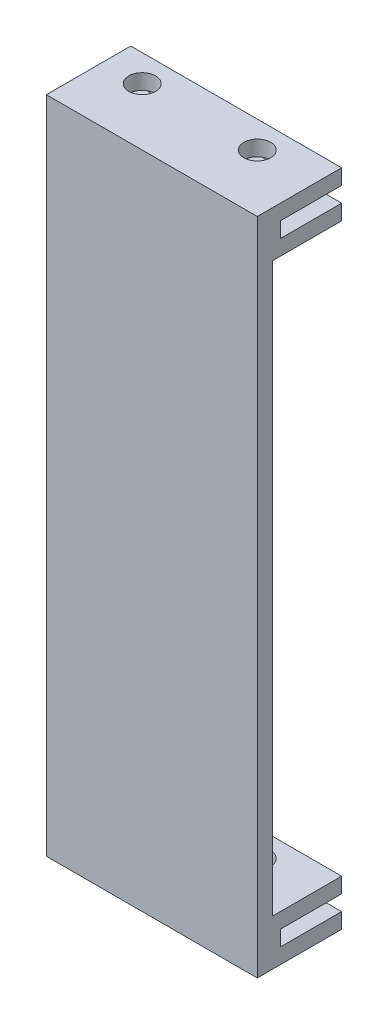
ISO-10303-21;
HEADER;
FILE_DESCRIPTION(('STEP AP214'),'2;1');
FILE_NAME('part.step','',(''),(''),'','','');
FILE_SCHEMA(('AUTOMOTIVE_DESIGN { 1 0 10303 214 1 1 1 1 }'));
ENDSEC;
DATA;
#1=APPLICATION_CONTEXT('core data for automotive mechanical design processes');
#2=APPLICATION_PROTOCOL_DEFINITION('international standard','automotive_design',2000,#1);
#3=PRODUCT_CONTEXT('',#1,'mechanical');
#4=PRODUCT('Part','Part','',(#3));
#5=PRODUCT_RELATED_PRODUCT_CATEGORY('part','',(#4));
#6=PRODUCT_DEFINITION_FORMATION('','',#4);
#7=PRODUCT_DEFINITION_CONTEXT('part definition',#1,'design');
#8=PRODUCT_DEFINITION('design','',#6,#7);
#9=PRODUCT_DEFINITION_SHAPE('','',#8);
#10=(LENGTH_UNIT() NAMED_UNIT(*) SI_UNIT(.MILLI.,.METRE.));
#11=(NAMED_UNIT(*) PLANE_ANGLE_UNIT() SI_UNIT($,.RADIAN.));
#12=(NAMED_UNIT(*) SI_UNIT($,.STERADIAN.) SOLID_ANGLE_UNIT());
#13=UNCERTAINTY_MEASURE_WITH_UNIT(LENGTH_MEASURE(1.E-05),#10,'distance_accuracy_value','');
#14=(GEOMETRIC_REPRESENTATION_CONTEXT(3) GLOBAL_UNCERTAINTY_ASSIGNED_CONTEXT((#13)) GLOBAL_UNIT_ASSIGNED_CONTEXT((#10,
#11,#12)) REPRESENTATION_CONTEXT('',''));
#15=CARTESIAN_POINT('',(0.,0.,0.));
#16=DIRECTION('',(0.,0.,1.));
#17=DIRECTION('',(1.,0.,0.));
#18=AXIS2_PLACEMENT_3D('',#15,#16,#17);
#19=CARTESIAN_POINT('',(-15.,80.,-5.5));
#20=DIRECTION('',(0.,0.,-1.));
#21=DIRECTION('',(-1.,0.,0.));
#22=AXIS2_PLACEMENT_3D('',#19,#20,#21);
#23=PLANE('',#22);
#24=DIRECTION('',(-1.,0.,0.));
#25=VECTOR('',#24,1.);
#26=CARTESIAN_POINT('',(-15.,80.,-5.5));
#27=LINE('',#26,#25);
#28=CARTESIAN_POINT('',(15.,80.,-5.5));
#29=VERTEX_POINT('',#28);
#30=CARTESIAN_POINT('',(-12.5,80.,-5.5));
#31=VERTEX_POINT('',#30);
#32=EDGE_CURVE('E322',#29,#31,#27,.T.);
#33=ORIENTED_EDGE('',*,*,#32,.T.);
#34=DIRECTION('',(0.,1.,0.));
#35=VECTOR('',#34,1.);
#36=CARTESIAN_POINT('',(-12.5,86.,-5.5));
#37=LINE('',#36,#35);
#38=CARTESIAN_POINT('',(-12.5,82.,-5.5));
#39=VERTEX_POINT('',#38);
#40=EDGE_CURVE('E178',#31,#39,#37,.T.);
#41=ORIENTED_EDGE('',*,*,#40,.T.);
#42=DIRECTION('',(1.,0.,0.));
#43=VECTOR('',#42,1.);
#44=CARTESIAN_POINT('',(-15.,82.,-5.5));
#45=LINE('',#44,#43);
#46=CARTESIAN_POINT('',(15.,82.,-5.5));
#47=VERTEX_POINT('',#46);
#48=EDGE_CURVE('E54',#39,#47,#45,.T.);
#49=ORIENTED_EDGE('',*,*,#48,.T.);
#50=DIRECTION('',(0.,1.,0.));
#51=VECTOR('',#50,1.);
#52=CARTESIAN_POINT('',(15.,80.,-5.5));
#53=LINE('',#52,#51);
#54=EDGE_CURVE('E195',#29,#47,#53,.T.);
#55=ORIENTED_EDGE('',*,*,#54,.F.);
#56=EDGE_LOOP('',(#33,#41,#49,#55));
#57=FACE_BOUND('',#56,.T.);
#58=ADVANCED_FACE('F50',(#57),#23,.T.);
#59=DIRECTION('',(-1.,0.,0.));
#60=VECTOR('',#59,1.);
#61=CARTESIAN_POINT('',(-15.,84.,-5.5));
#62=LINE('',#61,#60);
#63=CARTESIAN_POINT('',(15.,84.,-5.5));
#64=VERTEX_POINT('',#63);
#65=CARTESIAN_POINT('',(-12.5,84.,-5.5));
#66=VERTEX_POINT('',#65);
#67=EDGE_CURVE('E279',#64,#66,#62,.T.);
#68=ORIENTED_EDGE('',*,*,#67,.T.);
#69=CARTESIAN_POINT('',(-12.5,86.,-5.5));
#70=VERTEX_POINT('',#69);
#71=EDGE_CURVE('E62',#66,#70,#37,.T.);
#72=ORIENTED_EDGE('',*,*,#71,.T.);
#73=DIRECTION('',(-1.,0.,0.));
#74=VECTOR('',#73,1.);
#75=CARTESIAN_POINT('',(-15.,86.,-5.5));
#76=LINE('',#75,#74);
#77=CARTESIAN_POINT('',(15.,86.,-5.5));
#78=VERTEX_POINT('',#77);
#79=EDGE_CURVE('E176',#78,#70,#76,.T.);
#80=ORIENTED_EDGE('',*,*,#79,.F.);
#81=EDGE_CURVE('E198',#64,#78,#53,.T.);
#82=ORIENTED_EDGE('',*,*,#81,.F.);
#83=EDGE_LOOP('',(#68,#72,#80,#82));
#84=FACE_BOUND('',#83,.T.);
#85=ADVANCED_FACE('F335',(#84),#23,.T.);
#86=CARTESIAN_POINT('',(15.,6.,-5.5));
#87=DIRECTION('',(-1.,0.,0.));
#88=DIRECTION('',(0.,0.,1.));
#89=AXIS2_PLACEMENT_3D('',#86,#87,#88);
#90=PLANE('',#89);
#91=DIRECTION('',(0.,0.,-1.));
#92=VECTOR('',#91,1.);
#93=CARTESIAN_POINT('',(15.,82.,-5.5));
#94=LINE('',#93,#92);
#95=CARTESIAN_POINT('',(15.,82.,2.5));
#96=VERTEX_POINT('',#95);
#97=EDGE_CURVE('E320',#96,#47,#94,.T.);
#98=ORIENTED_EDGE('',*,*,#97,.F.);
#99=DIRECTION('',(0.,-1.,0.));
#100=VECTOR('',#99,1.);
#101=CARTESIAN_POINT('',(15.,6.,2.5));
#102=LINE('',#101,#100);
#103=CARTESIAN_POINT('',(15.,84.,2.5));
#104=VERTEX_POINT('',#103);
#105=EDGE_CURVE('E189',#104,#96,#102,.T.);
#106=ORIENTED_EDGE('',*,*,#105,.F.);
#107=DIRECTION('',(0.,0.,1.));
#108=VECTOR('',#107,1.);
#109=CARTESIAN_POINT('',(15.,84.,-5.5));
#110=LINE('',#109,#108);
#111=EDGE_CURVE('E312',#64,#104,#110,.T.);
#112=ORIENTED_EDGE('',*,*,#111,.F.);
#113=ORIENTED_EDGE('',*,*,#81,.T.);
#114=DIRECTION('',(0.,0.,-1.));
#115=VECTOR('',#114,1.);
#116=CARTESIAN_POINT('',(15.,86.,-5.5));
#117=LINE('',#116,#115);
#118=CARTESIAN_POINT('',(15.,86.,5.5));
#119=VERTEX_POINT('',#118);
#120=EDGE_CURVE('E183',#119,#78,#117,.T.);
#121=ORIENTED_EDGE('',*,*,#120,.F.);
#122=DIRECTION('',(0.,-1.,0.));
#123=VECTOR('',#122,1.);
#124=CARTESIAN_POINT('',(15.,6.,5.5));
#125=LINE('',#124,#123);
#126=CARTESIAN_POINT('',(15.,0.,5.5));
#127=VERTEX_POINT('',#126);
#128=EDGE_CURVE('E185',#119,#127,#125,.T.);
#129=ORIENTED_EDGE('',*,*,#128,.T.);
#130=DIRECTION('',(0.,0.,-1.));
#131=VECTOR('',#130,1.);
#132=CARTESIAN_POINT('',(15.,0.,-5.5));
#133=LINE('',#132,#131);
#134=CARTESIAN_POINT('',(15.,0.,-5.5));
#135=VERTEX_POINT('',#134);
#136=EDGE_CURVE('E257',#127,#135,#133,.T.);
#137=ORIENTED_EDGE('',*,*,#136,.T.);
#138=DIRECTION('',(0.,-1.,0.));
#139=VECTOR('',#138,1.);
#140=CARTESIAN_POINT('',(15.,6.,-5.5));
#141=LINE('',#140,#139);
#142=CARTESIAN_POINT('',(15.,2.,-5.5));
#143=VERTEX_POINT('',#142);
#144=EDGE_CURVE('E266',#143,#135,#141,.T.);
#145=ORIENTED_EDGE('',*,*,#144,.F.);
#146=DIRECTION('',(0.,0.,1.));
#147=VECTOR('',#146,1.);
#148=CARTESIAN_POINT('',(15.,2.,-5.5));
#149=LINE('',#148,#147);
#150=CARTESIAN_POINT('',(15.,2.,2.5));
#151=VERTEX_POINT('',#150);
#152=EDGE_CURVE('E254',#143,#151,#149,.T.);
#153=ORIENTED_EDGE('',*,*,#152,.T.);
#154=DIRECTION('',(0.,1.,0.));
#155=VECTOR('',#154,1.);
#156=CARTESIAN_POINT('',(15.,6.,2.5));
#157=LINE('',#156,#155);
#158=CARTESIAN_POINT('',(15.,4.,2.5));
#159=VERTEX_POINT('',#158);
#160=EDGE_CURVE('E244',#151,#159,#157,.T.);
#161=ORIENTED_EDGE('',*,*,#160,.T.);
#162=DIRECTION('',(0.,0.,-1.));
#163=VECTOR('',#162,1.);
#164=CARTESIAN_POINT('',(15.,4.,-5.5));
#165=LINE('',#164,#163);
#166=CARTESIAN_POINT('',(15.,4.,-5.5));
#167=VERTEX_POINT('',#166);
#168=EDGE_CURVE('E249',#159,#167,#165,.T.);
#169=ORIENTED_EDGE('',*,*,#168,.T.);
#170=CARTESIAN_POINT('',(15.,6.,-5.5));
#171=VERTEX_POINT('',#170);
#172=EDGE_CURVE('E268',#171,#167,#141,.T.);
#173=ORIENTED_EDGE('',*,*,#172,.F.);
#174=DIRECTION('',(0.,0.,-1.));
#175=VECTOR('',#174,1.);
#176=CARTESIAN_POINT('',(15.,6.,-5.5));
#177=LINE('',#176,#175);
#178=CARTESIAN_POINT('',(15.,6.,3.5));
#179=VERTEX_POINT('',#178);
#180=EDGE_CURVE('E260',#179,#171,#177,.T.);
#181=ORIENTED_EDGE('',*,*,#180,.F.);
#182=DIRECTION('',(0.,-1.,0.));
#183=VECTOR('',#182,1.);
#184=CARTESIAN_POINT('',(15.,80.,3.5));
#185=LINE('',#184,#183);
#186=CARTESIAN_POINT('',(15.,80.,3.5));
#187=VERTEX_POINT('',#186);
#188=EDGE_CURVE('E240',#187,#179,#185,.T.);
#189=ORIENTED_EDGE('',*,*,#188,.F.);
#190=DIRECTION('',(0.,0.,-1.));
#191=VECTOR('',#190,1.);
#192=CARTESIAN_POINT('',(15.,80.,-5.5));
#193=LINE('',#192,#191);
#194=EDGE_CURVE('E187',#187,#29,#193,.T.);
#195=ORIENTED_EDGE('',*,*,#194,.T.);
#196=ORIENTED_EDGE('',*,*,#54,.T.);
#197=EDGE_LOOP('',(#98,#106,#112,#113,#121,#129,#137,#145,#153,#161,#169,#173,#181,#189,#195,#196));
#198=FACE_BOUND('',#197,.T.);
#199=ADVANCED_FACE('F47',(#198),#90,.F.);
#200=CARTESIAN_POINT('',(-15.,6.,-5.5));
#201=DIRECTION('',(0.,0.,1.));
#202=DIRECTION('',(1.,0.,0.));
#203=AXIS2_PLACEMENT_3D('',#200,#201,#202);
#204=PLANE('',#203);
#205=DIRECTION('',(0.,-1.,0.));
#206=VECTOR('',#205,1.);
#207=CARTESIAN_POINT('',(-12.5,0.,-5.5));
#208=LINE('',#207,#206);
#209=CARTESIAN_POINT('',(-12.5,2.,-5.5));
#210=VERTEX_POINT('',#209);
#211=CARTESIAN_POINT('',(-12.5,0.,-5.5));
#212=VERTEX_POINT('',#211);
#213=EDGE_CURVE('E193',#210,#212,#208,.T.);
#214=ORIENTED_EDGE('',*,*,#213,.F.);
#215=DIRECTION('',(1.,0.,0.));
#216=VECTOR('',#215,1.);
#217=CARTESIAN_POINT('',(-15.,2.,-5.5));
#218=LINE('',#217,#216);
#219=EDGE_CURVE('E277',#210,#143,#218,.T.);
#220=ORIENTED_EDGE('',*,*,#219,.T.);
#221=ORIENTED_EDGE('',*,*,#144,.T.);
#222=DIRECTION('',(-1.,0.,0.));
#223=VECTOR('',#222,1.);
#224=CARTESIAN_POINT('',(-15.,0.,-5.5));
#225=LINE('',#224,#223);
#226=EDGE_CURVE('E264',#135,#212,#225,.T.);
#227=ORIENTED_EDGE('',*,*,#226,.T.);
#228=EDGE_LOOP('',(#214,#220,#221,#227));
#229=FACE_BOUND('',#228,.T.);
#230=ADVANCED_FACE('F415',(#229),#204,.F.);
#231=CARTESIAN_POINT('',(-15.,6.,5.5));
#232=DIRECTION('',(0.,0.,-1.));
#233=DIRECTION('',(-1.,0.,0.));
#234=AXIS2_PLACEMENT_3D('',#231,#232,#233);
#235=PLANE('',#234);
#236=DIRECTION('',(1.,0.,0.));
#237=VECTOR('',#236,1.);
#238=CARTESIAN_POINT('',(-15.,86.,5.5));
#239=LINE('',#238,#237);
#240=CARTESIAN_POINT('',(-12.5,86.,5.5));
#241=VERTEX_POINT('',#240);
#242=EDGE_CURVE('E173',#241,#119,#239,.T.);
#243=ORIENTED_EDGE('',*,*,#242,.F.);
#244=DIRECTION('',(0.,1.,0.));
#245=VECTOR('',#244,1.);
#246=CARTESIAN_POINT('',(-12.5,0.,5.5));
#247=LINE('',#246,#245);
#248=CARTESIAN_POINT('',(-12.5,0.,5.5));
#249=VERTEX_POINT('',#248);
#250=EDGE_CURVE('E160',#249,#241,#247,.T.);
#251=ORIENTED_EDGE('',*,*,#250,.F.);
#252=DIRECTION('',(1.,0.,0.));
#253=VECTOR('',#252,1.);
#254=CARTESIAN_POINT('',(-15.,0.,5.5));
#255=LINE('',#254,#253);
#256=EDGE_CURVE('E258',#249,#127,#255,.T.);
#257=ORIENTED_EDGE('',*,*,#256,.T.);
#258=ORIENTED_EDGE('',*,*,#128,.F.);
#259=EDGE_LOOP('',(#243,#251,#257,#258));
#260=FACE_BOUND('',#259,.T.);
#261=ADVANCED_FACE('F179',(#260),#235,.F.);
#262=CARTESIAN_POINT('',(0.,0.,0.));
#263=DIRECTION('',(0.,1.,0.));
#264=DIRECTION('',(0.,0.,1.));
#265=AXIS2_PLACEMENT_3D('',#262,#263,#264);
#266=PLANE('',#265);
#267=CARTESIAN_POINT('',(7.5,0.,-2.));
#268=DIRECTION('',(0.,1.,0.));
#269=DIRECTION('',(0.,0.,1.));
#270=AXIS2_PLACEMENT_3D('',#267,#268,#269);
#271=CIRCLE('',#270,1.75);
#272=CARTESIAN_POINT('',(7.5,0.,-0.249999999999999));
#273=VERTEX_POINT('',#272);
#274=EDGE_CURVE('E221',#273,#273,#271,.T.);
#275=ORIENTED_EDGE('',*,*,#274,.T.);
#276=EDGE_LOOP('',(#275));
#277=FACE_BOUND('',#276,.T.);
#278=CARTESIAN_POINT('',(-7.5,0.,-2.));
#279=DIRECTION('',(0.,1.,0.));
#280=DIRECTION('',(0.,0.,1.));
#281=AXIS2_PLACEMENT_3D('',#278,#279,#280);
#282=CIRCLE('',#281,1.75);
#283=CARTESIAN_POINT('',(-7.5,0.,-0.25));
#284=VERTEX_POINT('',#283);
#285=EDGE_CURVE('E233',#284,#284,#282,.T.);
#286=ORIENTED_EDGE('',*,*,#285,.T.);
#287=EDGE_LOOP('',(#286));
#288=FACE_BOUND('',#287,.T.);
#289=DIRECTION('',(0.,0.,1.));
#290=VECTOR('',#289,1.);
#291=CARTESIAN_POINT('',(-12.5,0.,-5.5));
#292=LINE('',#291,#290);
#293=EDGE_CURVE('E161',#212,#249,#292,.T.);
#294=ORIENTED_EDGE('',*,*,#293,.F.);
#295=ORIENTED_EDGE('',*,*,#226,.F.);
#296=ORIENTED_EDGE('',*,*,#136,.F.);
#297=ORIENTED_EDGE('',*,*,#256,.F.);
#298=EDGE_LOOP('',(#294,#295,#296,#297));
#299=FACE_BOUND('',#298,.T.);
#300=ADVANCED_FACE('F410',(#277,#288,#299),#266,.F.);
#301=CARTESIAN_POINT('',(-12.5,6.,-5.5));
#302=VERTEX_POINT('',#301);
#303=CARTESIAN_POINT('',(-12.5,4.,-5.5));
#304=VERTEX_POINT('',#303);
#305=EDGE_CURVE('E196',#302,#304,#208,.T.);
#306=ORIENTED_EDGE('',*,*,#305,.F.);
#307=DIRECTION('',(-1.,0.,0.));
#308=VECTOR('',#307,1.);
#309=CARTESIAN_POINT('',(-15.,6.,-5.5));
#310=LINE('',#309,#308);
#311=EDGE_CURVE('E256',#171,#302,#310,.T.);
#312=ORIENTED_EDGE('',*,*,#311,.F.);
#313=ORIENTED_EDGE('',*,*,#172,.T.);
#314=DIRECTION('',(-1.,0.,0.));
#315=VECTOR('',#314,1.);
#316=CARTESIAN_POINT('',(-15.,4.,-5.5));
#317=LINE('',#316,#315);
#318=EDGE_CURVE('E271',#167,#304,#317,.T.);
#319=ORIENTED_EDGE('',*,*,#318,.T.);
#320=EDGE_LOOP('',(#306,#312,#313,#319));
#321=FACE_BOUND('',#320,.T.);
#322=ADVANCED_FACE('F407',(#321),#204,.F.);
#323=CARTESIAN_POINT('',(0.,6.,0.));
#324=DIRECTION('',(0.,1.,0.));
#325=DIRECTION('',(0.,0.,1.));
#326=AXIS2_PLACEMENT_3D('',#323,#324,#325);
#327=PLANE('',#326);
#328=DIRECTION('',(0.,0.,-1.));
#329=VECTOR('',#328,1.);
#330=CARTESIAN_POINT('',(-12.5,6.,0.));
#331=LINE('',#330,#329);
#332=CARTESIAN_POINT('',(-12.5,6.00000000000001,3.5));
#333=VERTEX_POINT('',#332);
#334=EDGE_CURVE('E204',#333,#302,#331,.T.);
#335=ORIENTED_EDGE('',*,*,#334,.F.);
#336=DIRECTION('',(-1.,0.,0.));
#337=VECTOR('',#336,1.);
#338=CARTESIAN_POINT('',(-2.,6.,3.5));
#339=LINE('',#338,#337);
#340=EDGE_CURVE('E69',#179,#333,#339,.T.);
#341=ORIENTED_EDGE('',*,*,#340,.F.);
#342=ORIENTED_EDGE('',*,*,#180,.T.);
#343=ORIENTED_EDGE('',*,*,#311,.T.);
#344=EDGE_LOOP('',(#335,#341,#342,#343));
#345=FACE_BOUND('',#344,.T.);
#346=CARTESIAN_POINT('',(-7.5,6.,-2.));
#347=DIRECTION('',(0.,1.,0.));
#348=DIRECTION('',(0.,0.,1.));
#349=AXIS2_PLACEMENT_3D('',#346,#347,#348);
#350=CIRCLE('',#349,1.75);
#351=CARTESIAN_POINT('',(-7.5,6.,-0.25));
#352=VERTEX_POINT('',#351);
#353=EDGE_CURVE('E213',#352,#352,#350,.T.);
#354=ORIENTED_EDGE('',*,*,#353,.F.);
#355=EDGE_LOOP('',(#354));
#356=FACE_BOUND('',#355,.T.);
#357=CARTESIAN_POINT('',(7.5,6.,-2.));
#358=DIRECTION('',(0.,1.,0.));
#359=DIRECTION('',(0.,0.,-1.));
#360=AXIS2_PLACEMENT_3D('',#357,#358,#359);
#361=CIRCLE('',#360,1.75);
#362=CARTESIAN_POINT('',(7.5,6.,-3.75));
#363=VERTEX_POINT('',#362);
#364=EDGE_CURVE('E211',#363,#363,#361,.T.);
#365=ORIENTED_EDGE('',*,*,#364,.F.);
#366=EDGE_LOOP('',(#365));
#367=FACE_BOUND('',#366,.T.);
#368=ADVANCED_FACE('F399',(#345,#356,#367),#327,.T.);
#369=CARTESIAN_POINT('',(129.,2.,-13.5));
#370=DIRECTION('',(0.,-1.,0.));
#371=DIRECTION('',(0.,0.,-1.));
#372=AXIS2_PLACEMENT_3D('',#369,#370,#371);
#373=PLANE('',#372);
#374=CARTESIAN_POINT('',(-7.5,2.,-2.));
#375=DIRECTION('',(0.,-1.,0.));
#376=DIRECTION('',(0.,0.,-1.));
#377=AXIS2_PLACEMENT_3D('',#374,#375,#376);
#378=CIRCLE('',#377,1.75);
#379=CARTESIAN_POINT('',(-7.5,2.,-3.75));
#380=VERTEX_POINT('',#379);
#381=EDGE_CURVE('E226',#380,#380,#378,.T.);
#382=ORIENTED_EDGE('',*,*,#381,.T.);
#383=EDGE_LOOP('',(#382));
#384=FACE_BOUND('',#383,.T.);
#385=CARTESIAN_POINT('',(7.5,2.,-2.));
#386=DIRECTION('',(0.,-1.,0.));
#387=DIRECTION('',(0.,0.,-1.));
#388=AXIS2_PLACEMENT_3D('',#385,#386,#387);
#389=CIRCLE('',#388,1.75);
#390=CARTESIAN_POINT('',(7.5,2.,-3.75));
#391=VERTEX_POINT('',#390);
#392=EDGE_CURVE('E222',#391,#391,#389,.T.);
#393=ORIENTED_EDGE('',*,*,#392,.T.);
#394=EDGE_LOOP('',(#393));
#395=FACE_BOUND('',#394,.T.);
#396=ORIENTED_EDGE('',*,*,#219,.F.);
#397=DIRECTION('',(0.,0.,1.));
#398=VECTOR('',#397,1.);
#399=CARTESIAN_POINT('',(-12.5,2.,-13.5));
#400=LINE('',#399,#398);
#401=CARTESIAN_POINT('',(-12.5,2.,2.5));
#402=VERTEX_POINT('',#401);
#403=EDGE_CURVE('E212',#210,#402,#400,.T.);
#404=ORIENTED_EDGE('',*,*,#403,.T.);
#405=DIRECTION('',(-1.,0.,0.));
#406=VECTOR('',#405,1.);
#407=CARTESIAN_POINT('',(129.,2.,2.5));
#408=LINE('',#407,#406);
#409=EDGE_CURVE('E245',#151,#402,#408,.T.);
#410=ORIENTED_EDGE('',*,*,#409,.F.);
#411=ORIENTED_EDGE('',*,*,#152,.F.);
#412=EDGE_LOOP('',(#396,#404,#410,#411));
#413=FACE_BOUND('',#412,.T.);
#414=ADVANCED_FACE('F391',(#384,#395,#413),#373,.F.);
#415=CARTESIAN_POINT('',(129.,4.,-13.5));
#416=DIRECTION('',(0.,1.,0.));
#417=DIRECTION('',(0.,0.,1.));
#418=AXIS2_PLACEMENT_3D('',#415,#416,#417);
#419=PLANE('',#418);
#420=CARTESIAN_POINT('',(-7.5,4.,-2.));
#421=DIRECTION('',(0.,1.,0.));
#422=DIRECTION('',(0.,0.,1.));
#423=AXIS2_PLACEMENT_3D('',#420,#421,#422);
#424=CIRCLE('',#423,1.75);
#425=CARTESIAN_POINT('',(-7.5,4.,-0.25));
#426=VERTEX_POINT('',#425);
#427=EDGE_CURVE('E227',#426,#426,#424,.T.);
#428=ORIENTED_EDGE('',*,*,#427,.T.);
#429=EDGE_LOOP('',(#428));
#430=FACE_BOUND('',#429,.T.);
#431=CARTESIAN_POINT('',(7.5,4.,-2.));
#432=DIRECTION('',(0.,1.,0.));
#433=DIRECTION('',(0.,0.,1.));
#434=AXIS2_PLACEMENT_3D('',#431,#432,#433);
#435=CIRCLE('',#434,1.75);
#436=CARTESIAN_POINT('',(7.5,4.,-0.249999999999999));
#437=VERTEX_POINT('',#436);
#438=EDGE_CURVE('E216',#437,#437,#435,.T.);
#439=ORIENTED_EDGE('',*,*,#438,.T.);
#440=EDGE_LOOP('',(#439));
#441=FACE_BOUND('',#440,.T.);
#442=DIRECTION('',(-1.,0.,0.));
#443=VECTOR('',#442,1.);
#444=CARTESIAN_POINT('',(129.,4.,2.5));
#445=LINE('',#444,#443);
#446=CARTESIAN_POINT('',(-12.5,4.,2.5));
#447=VERTEX_POINT('',#446);
#448=EDGE_CURVE('E241',#159,#447,#445,.T.);
#449=ORIENTED_EDGE('',*,*,#448,.T.);
#450=DIRECTION('',(0.,0.,-1.));
#451=VECTOR('',#450,1.);
#452=CARTESIAN_POINT('',(-12.5,4.,-13.5));
#453=LINE('',#452,#451);
#454=EDGE_CURVE('E206',#447,#304,#453,.T.);
#455=ORIENTED_EDGE('',*,*,#454,.T.);
#456=ORIENTED_EDGE('',*,*,#318,.F.);
#457=ORIENTED_EDGE('',*,*,#168,.F.);
#458=EDGE_LOOP('',(#449,#455,#456,#457));
#459=FACE_BOUND('',#458,.T.);
#460=ADVANCED_FACE('F397',(#430,#441,#459),#419,.F.);
#461=CARTESIAN_POINT('',(129.,2.,2.5));
#462=DIRECTION('',(0.,0.,1.));
#463=DIRECTION('',(1.,0.,0.));
#464=AXIS2_PLACEMENT_3D('',#461,#462,#463);
#465=PLANE('',#464);
#466=ORIENTED_EDGE('',*,*,#409,.T.);
#467=DIRECTION('',(0.,1.,0.));
#468=VECTOR('',#467,1.);
#469=CARTESIAN_POINT('',(-12.5,2.,2.5));
#470=LINE('',#469,#468);
#471=EDGE_CURVE('E203',#402,#447,#470,.T.);
#472=ORIENTED_EDGE('',*,*,#471,.T.);
#473=ORIENTED_EDGE('',*,*,#448,.F.);
#474=ORIENTED_EDGE('',*,*,#160,.F.);
#475=EDGE_LOOP('',(#466,#472,#473,#474));
#476=FACE_BOUND('',#475,.T.);
#477=ADVANCED_FACE('F393',(#476),#465,.F.);
#478=CARTESIAN_POINT('',(-2.,80.,3.5));
#479=DIRECTION('',(0.,0.,1.));
#480=DIRECTION('',(1.,0.,0.));
#481=AXIS2_PLACEMENT_3D('',#478,#479,#480);
#482=PLANE('',#481);
#483=ORIENTED_EDGE('',*,*,#340,.T.);
#484=DIRECTION('',(0.,1.,0.));
#485=VECTOR('',#484,1.);
#486=CARTESIAN_POINT('',(-12.5,80.,3.5));
#487=LINE('',#486,#485);
#488=CARTESIAN_POINT('',(-12.5,80.,3.5));
#489=VERTEX_POINT('',#488);
#490=EDGE_CURVE('E170',#333,#489,#487,.T.);
#491=ORIENTED_EDGE('',*,*,#490,.T.);
#492=DIRECTION('',(-1.,0.,0.));
#493=VECTOR('',#492,1.);
#494=CARTESIAN_POINT('',(-2.,80.,3.5));
#495=LINE('',#494,#493);
#496=EDGE_CURVE('E234',#187,#489,#495,.T.);
#497=ORIENTED_EDGE('',*,*,#496,.F.);
#498=ORIENTED_EDGE('',*,*,#188,.T.);
#499=EDGE_LOOP('',(#483,#491,#497,#498));
#500=FACE_BOUND('',#499,.T.);
#501=ADVANCED_FACE('F389',(#500),#482,.F.);
#502=CARTESIAN_POINT('',(7.5,-138.,-2.));
#503=DIRECTION('',(0.,1.,0.));
#504=DIRECTION('',(0.,0.,1.));
#505=AXIS2_PLACEMENT_3D('',#502,#503,#504);
#506=CYLINDRICAL_SURFACE('',#505,1.75);
#507=ORIENTED_EDGE('',*,*,#364,.T.);
#508=EDGE_LOOP('',(#507));
#509=FACE_BOUND('',#508,.T.);
#510=ORIENTED_EDGE('',*,*,#438,.F.);
#511=EDGE_LOOP('',(#510));
#512=FACE_BOUND('',#511,.T.);
#513=ADVANCED_FACE('F390',(#509,#512),#506,.F.);
#514=CARTESIAN_POINT('',(-7.5,-138.,-2.));
#515=DIRECTION('',(0.,1.,0.));
#516=DIRECTION('',(0.,0.,1.));
#517=AXIS2_PLACEMENT_3D('',#514,#515,#516);
#518=CYLINDRICAL_SURFACE('',#517,1.75);
#519=ORIENTED_EDGE('',*,*,#353,.T.);
#520=EDGE_LOOP('',(#519));
#521=FACE_BOUND('',#520,.T.);
#522=ORIENTED_EDGE('',*,*,#427,.F.);
#523=EDGE_LOOP('',(#522));
#524=FACE_BOUND('',#523,.T.);
#525=ADVANCED_FACE('F384',(#521,#524),#518,.F.);
#526=ORIENTED_EDGE('',*,*,#392,.F.);
#527=EDGE_LOOP('',(#526));
#528=FACE_BOUND('',#527,.T.);
#529=ORIENTED_EDGE('',*,*,#274,.F.);
#530=EDGE_LOOP('',(#529));
#531=FACE_BOUND('',#530,.T.);
#532=ADVANCED_FACE('F382',(#528,#531),#506,.F.);
#533=ORIENTED_EDGE('',*,*,#381,.F.);
#534=EDGE_LOOP('',(#533));
#535=FACE_BOUND('',#534,.T.);
#536=ORIENTED_EDGE('',*,*,#285,.F.);
#537=EDGE_LOOP('',(#536));
#538=FACE_BOUND('',#537,.T.);
#539=ADVANCED_FACE('F377',(#535,#538),#518,.F.);
#540=CARTESIAN_POINT('',(-12.5,0.,0.));
#541=DIRECTION('',(1.,0.,0.));
#542=DIRECTION('',(0.,0.,-1.));
#543=AXIS2_PLACEMENT_3D('',#540,#541,#542);
#544=PLANE('',#543);
#545=ORIENTED_EDGE('',*,*,#250,.T.);
#546=DIRECTION('',(0.,0.,1.));
#547=VECTOR('',#546,1.);
#548=CARTESIAN_POINT('',(-12.5,86.,-5.5));
#549=LINE('',#548,#547);
#550=EDGE_CURVE('E163',#70,#241,#549,.T.);
#551=ORIENTED_EDGE('',*,*,#550,.F.);
#552=ORIENTED_EDGE('',*,*,#71,.F.);
#553=DIRECTION('',(0.,0.,1.));
#554=VECTOR('',#553,1.);
#555=CARTESIAN_POINT('',(-12.5,84.,-13.5));
#556=LINE('',#555,#554);
#557=CARTESIAN_POINT('',(-12.5,84.,2.5));
#558=VERTEX_POINT('',#557);
#559=EDGE_CURVE('E11',#66,#558,#556,.T.);
#560=ORIENTED_EDGE('',*,*,#559,.T.);
#561=DIRECTION('',(0.,-1.,0.));
#562=VECTOR('',#561,1.);
#563=CARTESIAN_POINT('',(-12.5,84.,2.5));
#564=LINE('',#563,#562);
#565=CARTESIAN_POINT('',(-12.5,82.,2.5));
#566=VERTEX_POINT('',#565);
#567=EDGE_CURVE('E180',#558,#566,#564,.T.);
#568=ORIENTED_EDGE('',*,*,#567,.T.);
#569=DIRECTION('',(0.,0.,-1.));
#570=VECTOR('',#569,1.);
#571=CARTESIAN_POINT('',(-12.5,82.,-13.5));
#572=LINE('',#571,#570);
#573=EDGE_CURVE('E340',#566,#39,#572,.T.);
#574=ORIENTED_EDGE('',*,*,#573,.T.);
#575=ORIENTED_EDGE('',*,*,#40,.F.);
#576=DIRECTION('',(0.,0.,1.));
#577=VECTOR('',#576,1.);
#578=CARTESIAN_POINT('',(-12.5,80.,0.));
#579=LINE('',#578,#577);
#580=EDGE_CURVE('E339',#31,#489,#579,.T.);
#581=ORIENTED_EDGE('',*,*,#580,.T.);
#582=ORIENTED_EDGE('',*,*,#490,.F.);
#583=ORIENTED_EDGE('',*,*,#334,.T.);
#584=ORIENTED_EDGE('',*,*,#305,.T.);
#585=ORIENTED_EDGE('',*,*,#454,.F.);
#586=ORIENTED_EDGE('',*,*,#471,.F.);
#587=ORIENTED_EDGE('',*,*,#403,.F.);
#588=ORIENTED_EDGE('',*,*,#213,.T.);
#589=ORIENTED_EDGE('',*,*,#293,.T.);
#590=EDGE_LOOP('',(#545,#551,#552,#560,#568,#574,#575,#581,#582,#583,#584,#585,#586,#587,#588,#589));
#591=FACE_BOUND('',#590,.T.);
#592=ADVANCED_FACE('F158',(#591),#544,.F.);
#593=CARTESIAN_POINT('',(0.,80.,0.));
#594=DIRECTION('',(0.,-1.,0.));
#595=DIRECTION('',(0.,0.,1.));
#596=AXIS2_PLACEMENT_3D('',#593,#594,#595);
#597=PLANE('',#596);
#598=ORIENTED_EDGE('',*,*,#580,.F.);
#599=ORIENTED_EDGE('',*,*,#32,.F.);
#600=ORIENTED_EDGE('',*,*,#194,.F.);
#601=ORIENTED_EDGE('',*,*,#496,.T.);
#602=EDGE_LOOP('',(#598,#599,#600,#601));
#603=FACE_BOUND('',#602,.T.);
#604=CARTESIAN_POINT('',(-7.5,80.,-2.));
#605=DIRECTION('',(0.,1.,0.));
#606=DIRECTION('',(0.,0.,1.));
#607=AXIS2_PLACEMENT_3D('',#604,#605,#606);
#608=CIRCLE('',#607,1.75);
#609=CARTESIAN_POINT('',(-7.5,80.,-0.25));
#610=VERTEX_POINT('',#609);
#611=EDGE_CURVE('E286',#610,#610,#608,.T.);
#612=ORIENTED_EDGE('',*,*,#611,.T.);
#613=EDGE_LOOP('',(#612));
#614=FACE_BOUND('',#613,.T.);
#615=CARTESIAN_POINT('',(7.5,80.,-2.));
#616=DIRECTION('',(0.,1.,0.));
#617=DIRECTION('',(0.,0.,-1.));
#618=AXIS2_PLACEMENT_3D('',#615,#616,#617);
#619=CIRCLE('',#618,1.75);
#620=CARTESIAN_POINT('',(7.5,80.,-3.75));
#621=VERTEX_POINT('',#620);
#622=EDGE_CURVE('E342',#621,#621,#619,.T.);
#623=ORIENTED_EDGE('',*,*,#622,.T.);
#624=EDGE_LOOP('',(#623));
#625=FACE_BOUND('',#624,.T.);
#626=ADVANCED_FACE('F348',(#603,#614,#625),#597,.T.);
#627=CARTESIAN_POINT('',(0.,86.,0.));
#628=DIRECTION('',(0.,-1.,0.));
#629=DIRECTION('',(0.,0.,1.));
#630=AXIS2_PLACEMENT_3D('',#627,#628,#629);
#631=PLANE('',#630);
#632=CARTESIAN_POINT('',(-7.5,86.,-2.));
#633=DIRECTION('',(0.,-1.,0.));
#634=DIRECTION('',(0.,0.,-1.));
#635=AXIS2_PLACEMENT_3D('',#632,#633,#634);
#636=CIRCLE('',#635,1.75);
#637=CARTESIAN_POINT('',(-7.5,86.,-3.75));
#638=VERTEX_POINT('',#637);
#639=EDGE_CURVE('E300',#638,#638,#636,.F.);
#640=ORIENTED_EDGE('',*,*,#639,.F.);
#641=EDGE_LOOP('',(#640));
#642=FACE_BOUND('',#641,.T.);
#643=CARTESIAN_POINT('',(7.5,86.,-2.));
#644=DIRECTION('',(0.,-1.,0.));
#645=DIRECTION('',(0.,0.,-1.));
#646=AXIS2_PLACEMENT_3D('',#643,#644,#645);
#647=CIRCLE('',#646,1.75);
#648=CARTESIAN_POINT('',(7.5,86.,-3.75));
#649=VERTEX_POINT('',#648);
#650=EDGE_CURVE('E291',#649,#649,#647,.F.);
#651=ORIENTED_EDGE('',*,*,#650,.F.);
#652=EDGE_LOOP('',(#651));
#653=FACE_BOUND('',#652,.T.);
#654=ORIENTED_EDGE('',*,*,#79,.T.);
#655=ORIENTED_EDGE('',*,*,#550,.T.);
#656=ORIENTED_EDGE('',*,*,#242,.T.);
#657=ORIENTED_EDGE('',*,*,#120,.T.);
#658=EDGE_LOOP('',(#654,#655,#656,#657));
#659=FACE_BOUND('',#658,.T.);
#660=ADVANCED_FACE('F171',(#642,#653,#659),#631,.F.);
#661=CARTESIAN_POINT('',(129.,84.,2.5));
#662=DIRECTION('',(0.,0.,-1.));
#663=DIRECTION('',(-1.,0.,0.));
#664=AXIS2_PLACEMENT_3D('',#661,#662,#663);
#665=PLANE('',#664);
#666=ORIENTED_EDGE('',*,*,#567,.F.);
#667=DIRECTION('',(-1.,0.,0.));
#668=VECTOR('',#667,1.);
#669=CARTESIAN_POINT('',(129.,84.,2.5));
#670=LINE('',#669,#668);
#671=EDGE_CURVE('E307',#104,#558,#670,.T.);
#672=ORIENTED_EDGE('',*,*,#671,.F.);
#673=ORIENTED_EDGE('',*,*,#105,.T.);
#674=DIRECTION('',(-1.,0.,0.));
#675=VECTOR('',#674,1.);
#676=CARTESIAN_POINT('',(129.,82.,2.5));
#677=LINE('',#676,#675);
#678=EDGE_CURVE('E309',#96,#566,#677,.T.);
#679=ORIENTED_EDGE('',*,*,#678,.T.);
#680=EDGE_LOOP('',(#666,#672,#673,#679));
#681=FACE_BOUND('',#680,.T.);
#682=ADVANCED_FACE('F448',(#681),#665,.T.);
#683=CARTESIAN_POINT('',(129.,82.,-13.5));
#684=DIRECTION('',(0.,1.,0.));
#685=DIRECTION('',(0.,0.,1.));
#686=AXIS2_PLACEMENT_3D('',#683,#684,#685);
#687=PLANE('',#686);
#688=ORIENTED_EDGE('',*,*,#573,.F.);
#689=ORIENTED_EDGE('',*,*,#678,.F.);
#690=ORIENTED_EDGE('',*,*,#97,.T.);
#691=ORIENTED_EDGE('',*,*,#48,.F.);
#692=EDGE_LOOP('',(#688,#689,#690,#691));
#693=FACE_BOUND('',#692,.T.);
#694=CARTESIAN_POINT('',(-7.5,82.,-2.));
#695=DIRECTION('',(0.,1.,0.));
#696=DIRECTION('',(0.,0.,1.));
#697=AXIS2_PLACEMENT_3D('',#694,#695,#696);
#698=CIRCLE('',#697,1.75);
#699=CARTESIAN_POINT('',(-7.5,82.,-0.25));
#700=VERTEX_POINT('',#699);
#701=EDGE_CURVE('E292',#700,#700,#698,.F.);
#702=ORIENTED_EDGE('',*,*,#701,.T.);
#703=EDGE_LOOP('',(#702));
#704=FACE_BOUND('',#703,.T.);
#705=CARTESIAN_POINT('',(7.5,82.,-2.));
#706=DIRECTION('',(0.,1.,0.));
#707=DIRECTION('',(0.,0.,1.));
#708=AXIS2_PLACEMENT_3D('',#705,#706,#707);
#709=CIRCLE('',#708,1.75);
#710=CARTESIAN_POINT('',(7.5,82.,-0.249999999999999));
#711=VERTEX_POINT('',#710);
#712=EDGE_CURVE('E290',#711,#711,#709,.F.);
#713=ORIENTED_EDGE('',*,*,#712,.T.);
#714=EDGE_LOOP('',(#713));
#715=FACE_BOUND('',#714,.T.);
#716=ADVANCED_FACE('F444',(#693,#704,#715),#687,.T.);
#717=CARTESIAN_POINT('',(129.,84.,-13.5));
#718=DIRECTION('',(0.,-1.,0.));
#719=DIRECTION('',(0.,0.,-1.));
#720=AXIS2_PLACEMENT_3D('',#717,#718,#719);
#721=PLANE('',#720);
#722=ORIENTED_EDGE('',*,*,#559,.F.);
#723=ORIENTED_EDGE('',*,*,#67,.F.);
#724=ORIENTED_EDGE('',*,*,#111,.T.);
#725=ORIENTED_EDGE('',*,*,#671,.T.);
#726=EDGE_LOOP('',(#722,#723,#724,#725));
#727=FACE_BOUND('',#726,.T.);
#728=CARTESIAN_POINT('',(-7.5,84.,-2.));
#729=DIRECTION('',(0.,-1.,0.));
#730=DIRECTION('',(0.,0.,-1.));
#731=AXIS2_PLACEMENT_3D('',#728,#729,#730);
#732=CIRCLE('',#731,1.75);
#733=CARTESIAN_POINT('',(-7.5,84.,-3.75));
#734=VERTEX_POINT('',#733);
#735=EDGE_CURVE('E288',#734,#734,#732,.F.);
#736=ORIENTED_EDGE('',*,*,#735,.T.);
#737=EDGE_LOOP('',(#736));
#738=FACE_BOUND('',#737,.T.);
#739=CARTESIAN_POINT('',(7.5,84.,-2.));
#740=DIRECTION('',(0.,-1.,0.));
#741=DIRECTION('',(0.,0.,-1.));
#742=AXIS2_PLACEMENT_3D('',#739,#740,#741);
#743=CIRCLE('',#742,1.75);
#744=CARTESIAN_POINT('',(7.5,84.,-3.75));
#745=VERTEX_POINT('',#744);
#746=EDGE_CURVE('E287',#745,#745,#743,.F.);
#747=ORIENTED_EDGE('',*,*,#746,.T.);
#748=EDGE_LOOP('',(#747));
#749=FACE_BOUND('',#748,.T.);
#750=ADVANCED_FACE('F362',(#727,#738,#749),#721,.T.);
#751=CARTESIAN_POINT('',(7.5,224.,-2.));
#752=DIRECTION('',(0.,-1.,0.));
#753=DIRECTION('',(0.,0.,-1.));
#754=AXIS2_PLACEMENT_3D('',#751,#752,#753);
#755=CYLINDRICAL_SURFACE('',#754,1.75);
#756=ORIENTED_EDGE('',*,*,#746,.F.);
#757=EDGE_LOOP('',(#756));
#758=FACE_BOUND('',#757,.T.);
#759=ORIENTED_EDGE('',*,*,#650,.T.);
#760=EDGE_LOOP('',(#759));
#761=FACE_BOUND('',#760,.T.);
#762=ADVANCED_FACE('F351',(#758,#761),#755,.F.);
#763=CARTESIAN_POINT('',(-7.5,224.,-2.));
#764=DIRECTION('',(0.,-1.,0.));
#765=DIRECTION('',(0.,0.,-1.));
#766=AXIS2_PLACEMENT_3D('',#763,#764,#765);
#767=CYLINDRICAL_SURFACE('',#766,1.75);
#768=ORIENTED_EDGE('',*,*,#735,.F.);
#769=EDGE_LOOP('',(#768));
#770=FACE_BOUND('',#769,.T.);
#771=ORIENTED_EDGE('',*,*,#639,.T.);
#772=EDGE_LOOP('',(#771));
#773=FACE_BOUND('',#772,.T.);
#774=ADVANCED_FACE('F352',(#770,#773),#767,.F.);
#775=ORIENTED_EDGE('',*,*,#712,.F.);
#776=EDGE_LOOP('',(#775));
#777=FACE_BOUND('',#776,.T.);
#778=ORIENTED_EDGE('',*,*,#622,.F.);
#779=EDGE_LOOP('',(#778));
#780=FACE_BOUND('',#779,.T.);
#781=ADVANCED_FACE('F346',(#777,#780),#755,.F.);
#782=ORIENTED_EDGE('',*,*,#701,.F.);
#783=EDGE_LOOP('',(#782));
#784=FACE_BOUND('',#783,.T.);
#785=ORIENTED_EDGE('',*,*,#611,.F.);
#786=EDGE_LOOP('',(#785));
#787=FACE_BOUND('',#786,.T.);
#788=ADVANCED_FACE('F347',(#784,#787),#767,.F.);
#789=CLOSED_SHELL('',(#58,#85,#199,#230,#261,#300,#322,#368,#414,#460,#477,#501,#513,#525,#532,
#539,#592,#626,#660,#682,#716,#750,#762,#774,#781,#788));
#790=MANIFOLD_SOLID_BREP('B2',#789);
#791=ADVANCED_BREP_SHAPE_REPRESENTATION('',(#18,#790),#14);
#792=SHAPE_DEFINITION_REPRESENTATION(#9,#791);
ENDSEC;
END-ISO-10303-21;
